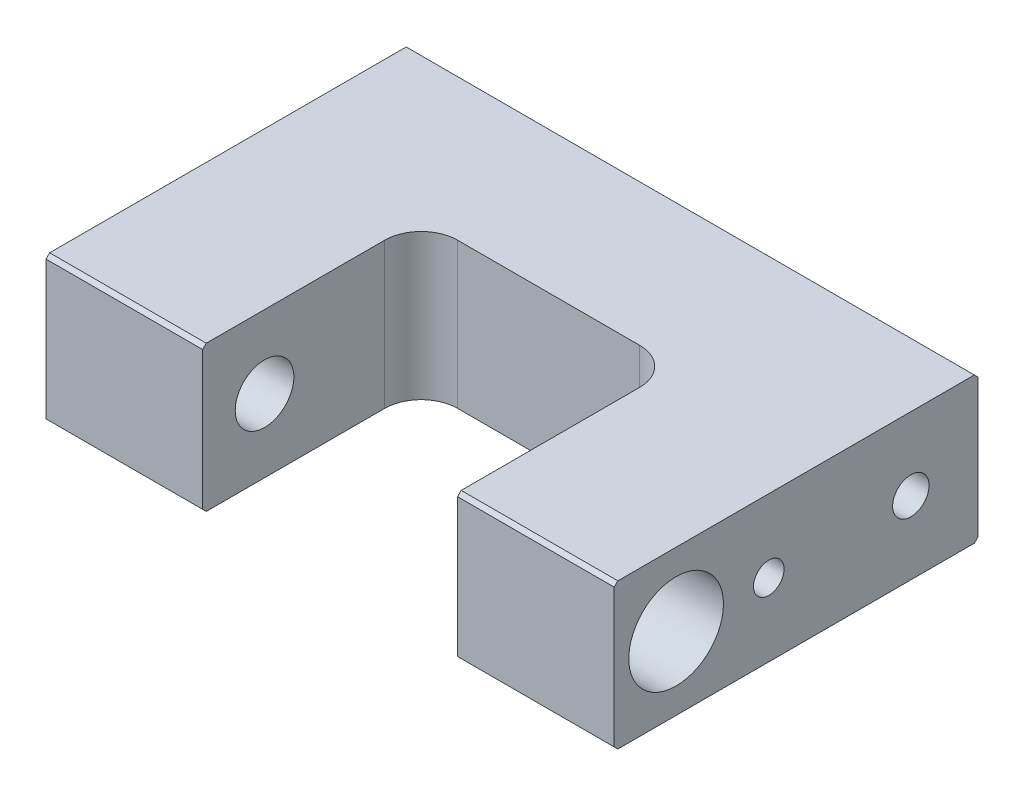
ISO-10303-21;
HEADER;
FILE_DESCRIPTION(('STEP AP214'),'2;1');
FILE_NAME('part.step','',(''),(''),'','','');
FILE_SCHEMA(('AUTOMOTIVE_DESIGN { 1 0 10303 214 1 1 1 1 }'));
ENDSEC;
DATA;
#1=APPLICATION_CONTEXT('core data for automotive mechanical design processes');
#2=APPLICATION_PROTOCOL_DEFINITION('international standard','automotive_design',2000,#1);
#3=PRODUCT_CONTEXT('',#1,'mechanical');
#4=PRODUCT('Part','Part','',(#3));
#5=PRODUCT_RELATED_PRODUCT_CATEGORY('part','',(#4));
#6=PRODUCT_DEFINITION_FORMATION('','',#4);
#7=PRODUCT_DEFINITION_CONTEXT('part definition',#1,'design');
#8=PRODUCT_DEFINITION('design','',#6,#7);
#9=PRODUCT_DEFINITION_SHAPE('','',#8);
#10=(LENGTH_UNIT() NAMED_UNIT(*) SI_UNIT(.MILLI.,.METRE.));
#11=(NAMED_UNIT(*) PLANE_ANGLE_UNIT() SI_UNIT($,.RADIAN.));
#12=(NAMED_UNIT(*) SI_UNIT($,.STERADIAN.) SOLID_ANGLE_UNIT());
#13=UNCERTAINTY_MEASURE_WITH_UNIT(LENGTH_MEASURE(1.E-05),#10,'distance_accuracy_value','');
#14=(GEOMETRIC_REPRESENTATION_CONTEXT(3) GLOBAL_UNCERTAINTY_ASSIGNED_CONTEXT((#13)) GLOBAL_UNIT_ASSIGNED_CONTEXT((#10,
#11,#12)) REPRESENTATION_CONTEXT('',''));
#15=CARTESIAN_POINT('',(0.,0.,0.));
#16=DIRECTION('',(0.,0.,1.));
#17=DIRECTION('',(1.,0.,0.));
#18=AXIS2_PLACEMENT_3D('',#15,#16,#17);
#19=CARTESIAN_POINT('',(39.,10.,18.7208121827411));
#20=DIRECTION('',(-1.,0.,0.));
#21=DIRECTION('',(0.,0.,1.));
#22=AXIS2_PLACEMENT_3D('',#19,#20,#21);
#23=CYLINDRICAL_SURFACE('',#22,4.025);
#24=CARTESIAN_POINT('',(17.5,10.,18.7208121827411));
#25=DIRECTION('',(1.,0.,0.));
#26=DIRECTION('',(0.,0.,-1.));
#27=AXIS2_PLACEMENT_3D('',#24,#25,#26);
#28=CIRCLE('',#27,4.025);
#29=CARTESIAN_POINT('',(17.5,10.,14.6958121827411));
#30=VERTEX_POINT('',#29);
#31=EDGE_CURVE('E237',#30,#30,#28,.T.);
#32=ORIENTED_EDGE('',*,*,#31,.F.);
#33=EDGE_LOOP('',(#32));
#34=FACE_BOUND('',#33,.T.);
#35=CARTESIAN_POINT('',(26.5,10.,18.7208121827411));
#36=DIRECTION('',(1.,0.,0.));
#37=DIRECTION('',(0.,0.,-1.));
#38=AXIS2_PLACEMENT_3D('',#35,#36,#37);
#39=CIRCLE('',#38,4.025);
#40=CARTESIAN_POINT('',(26.5,10.,14.6958121827411));
#41=VERTEX_POINT('',#40);
#42=EDGE_CURVE('E239',#41,#41,#39,.F.);
#43=ORIENTED_EDGE('',*,*,#42,.F.);
#44=EDGE_LOOP('',(#43));
#45=FACE_BOUND('',#44,.T.);
#46=ADVANCED_FACE('F41',(#34,#45),#23,.F.);
#47=CARTESIAN_POINT('',(-39.,20.,27.2208121827411));
#48=DIRECTION('',(0.,0.,-1.));
#49=DIRECTION('',(-1.,0.,0.));
#50=AXIS2_PLACEMENT_3D('',#47,#48,#49);
#51=PLANE('',#50);
#52=DIRECTION('',(0.,1.,0.));
#53=VECTOR('',#52,1.);
#54=CARTESIAN_POINT('',(17.5,0.,27.2208121827411));
#55=LINE('',#54,#53);
#56=CARTESIAN_POINT('',(17.5,0.5,27.2208121827411));
#57=VERTEX_POINT('',#56);
#58=CARTESIAN_POINT('',(17.5,19.5,27.2208121827411));
#59=VERTEX_POINT('',#58);
#60=EDGE_CURVE('E204',#57,#59,#55,.T.);
#61=ORIENTED_EDGE('',*,*,#60,.F.);
#62=DIRECTION('',(1.,0.,0.));
#63=VECTOR('',#62,1.);
#64=CARTESIAN_POINT('',(-39.,0.5,27.2208121827411));
#65=LINE('',#64,#63);
#66=CARTESIAN_POINT('',(39.,0.5,27.2208121827411));
#67=VERTEX_POINT('',#66);
#68=EDGE_CURVE('E244',#57,#67,#65,.T.);
#69=ORIENTED_EDGE('',*,*,#68,.T.);
#70=DIRECTION('',(0.,-1.,0.));
#71=VECTOR('',#70,1.);
#72=CARTESIAN_POINT('',(39.,20.,27.2208121827411));
#73=LINE('',#72,#71);
#74=CARTESIAN_POINT('',(39.,19.5,27.2208121827411));
#75=VERTEX_POINT('',#74);
#76=EDGE_CURVE('E223',#75,#67,#73,.T.);
#77=ORIENTED_EDGE('',*,*,#76,.F.);
#78=DIRECTION('',(-1.,0.,0.));
#79=VECTOR('',#78,1.);
#80=CARTESIAN_POINT('',(17.5,19.5,27.2208121827411));
#81=LINE('',#80,#79);
#82=EDGE_CURVE('E233',#75,#59,#81,.T.);
#83=ORIENTED_EDGE('',*,*,#82,.T.);
#84=EDGE_LOOP('',(#61,#69,#77,#83));
#85=FACE_BOUND('',#84,.T.);
#86=ADVANCED_FACE('F334',(#85),#51,.F.);
#87=CARTESIAN_POINT('',(39.,20.,-27.2208121827411));
#88=DIRECTION('',(-1.,0.,0.));
#89=DIRECTION('',(0.,0.,1.));
#90=AXIS2_PLACEMENT_3D('',#87,#88,#89);
#91=PLANE('',#90);
#92=CARTESIAN_POINT('',(39.,10.,6.));
#93=DIRECTION('',(1.,0.,0.));
#94=DIRECTION('',(0.,0.,-1.));
#95=AXIS2_PLACEMENT_3D('',#92,#93,#94);
#96=CIRCLE('',#95,2.1);
#97=CARTESIAN_POINT('',(39.,10.,3.9));
#98=VERTEX_POINT('',#97);
#99=EDGE_CURVE('E300',#98,#98,#96,.T.);
#100=ORIENTED_EDGE('',*,*,#99,.F.);
#101=EDGE_LOOP('',(#100));
#102=FACE_BOUND('',#101,.T.);
#103=CARTESIAN_POINT('',(39.,10.,-13.5));
#104=DIRECTION('',(1.,0.,0.));
#105=DIRECTION('',(0.,0.,-1.));
#106=AXIS2_PLACEMENT_3D('',#103,#104,#105);
#107=CIRCLE('',#106,2.5);
#108=CARTESIAN_POINT('',(39.,10.,-16.));
#109=VERTEX_POINT('',#108);
#110=EDGE_CURVE('E628',#109,#109,#107,.T.);
#111=ORIENTED_EDGE('',*,*,#110,.F.);
#112=EDGE_LOOP('',(#111));
#113=FACE_BOUND('',#112,.T.);
#114=CARTESIAN_POINT('',(39.,10.,18.7208121827411));
#115=DIRECTION('',(1.,0.,0.));
#116=DIRECTION('',(0.,0.,-1.));
#117=AXIS2_PLACEMENT_3D('',#114,#115,#116);
#118=CIRCLE('',#117,6.5);
#119=CARTESIAN_POINT('',(39.,10.,12.2208121827411));
#120=VERTEX_POINT('',#119);
#121=EDGE_CURVE('E631',#120,#120,#118,.T.);
#122=ORIENTED_EDGE('',*,*,#121,.F.);
#123=EDGE_LOOP('',(#122));
#124=FACE_BOUND('',#123,.T.);
#125=ORIENTED_EDGE('',*,*,#76,.T.);
#126=DIRECTION('',(0.,0.707106781186548,0.707106781186548));
#127=VECTOR('',#126,1.);
#128=CARTESIAN_POINT('',(39.,0.500000000000005,27.2208121827411));
#129=LINE('',#128,#127);
#130=CARTESIAN_POINT('',(39.,0.,26.7208121827411));
#131=VERTEX_POINT('',#130);
#132=EDGE_CURVE('E253',#67,#131,#129,.F.);
#133=ORIENTED_EDGE('',*,*,#132,.T.);
#134=DIRECTION('',(0.,0.,-1.));
#135=VECTOR('',#134,1.);
#136=CARTESIAN_POINT('',(39.,0.,-27.2208121827411));
#137=LINE('',#136,#135);
#138=CARTESIAN_POINT('',(39.,0.,-22.2208121827411));
#139=VERTEX_POINT('',#138);
#140=EDGE_CURVE('E207',#131,#139,#137,.T.);
#141=ORIENTED_EDGE('',*,*,#140,.T.);
#142=DIRECTION('',(0.,-0.707106781186549,0.707106781186547));
#143=VECTOR('',#142,1.);
#144=CARTESIAN_POINT('',(39.,0.500000000000014,-22.7208121827411));
#145=LINE('',#144,#143);
#146=CARTESIAN_POINT('',(39.,0.500000000000014,-22.7208121827411));
#147=VERTEX_POINT('',#146);
#148=EDGE_CURVE('E249',#139,#147,#145,.F.);
#149=ORIENTED_EDGE('',*,*,#148,.T.);
#150=DIRECTION('',(0.,1.,0.));
#151=VECTOR('',#150,1.);
#152=CARTESIAN_POINT('',(39.,20.,-22.7208121827411));
#153=LINE('',#152,#151);
#154=CARTESIAN_POINT('',(39.,19.5,-22.7208121827411));
#155=VERTEX_POINT('',#154);
#156=EDGE_CURVE('E292',#147,#155,#153,.T.);
#157=ORIENTED_EDGE('',*,*,#156,.T.);
#158=DIRECTION('',(0.,0.707106781186549,0.707106781186547));
#159=VECTOR('',#158,1.);
#160=CARTESIAN_POINT('',(39.,20.,-22.2208121827411));
#161=LINE('',#160,#159);
#162=CARTESIAN_POINT('',(39.,20.,-22.2208121827411));
#163=VERTEX_POINT('',#162);
#164=EDGE_CURVE('E247',#155,#163,#161,.T.);
#165=ORIENTED_EDGE('',*,*,#164,.T.);
#166=DIRECTION('',(0.,0.,-1.));
#167=VECTOR('',#166,1.);
#168=CARTESIAN_POINT('',(39.,20.,-27.2208121827411));
#169=LINE('',#168,#167);
#170=CARTESIAN_POINT('',(39.,20.,26.7208121827411));
#171=VERTEX_POINT('',#170);
#172=EDGE_CURVE('E216',#171,#163,#169,.T.);
#173=ORIENTED_EDGE('',*,*,#172,.F.);
#174=DIRECTION('',(0.,-0.707106781186548,0.707106781186548));
#175=VECTOR('',#174,1.);
#176=CARTESIAN_POINT('',(39.,20.,26.7208121827411));
#177=LINE('',#176,#175);
#178=EDGE_CURVE('E251',#171,#75,#177,.T.);
#179=ORIENTED_EDGE('',*,*,#178,.T.);
#180=EDGE_LOOP('',(#125,#133,#141,#149,#157,#165,#173,#179));
#181=FACE_BOUND('',#180,.T.);
#182=ADVANCED_FACE('F297',(#102,#113,#124,#181),#91,.F.);
#183=CARTESIAN_POINT('',(-39.,20.,-27.2208121827411));
#184=DIRECTION('',(1.,0.,0.));
#185=DIRECTION('',(0.,0.,-1.));
#186=AXIS2_PLACEMENT_3D('',#183,#184,#185);
#187=PLANE('',#186);
#188=CARTESIAN_POINT('',(-39.,10.,18.7208121827411));
#189=DIRECTION('',(-1.,0.,0.));
#190=DIRECTION('',(0.,0.,1.));
#191=AXIS2_PLACEMENT_3D('',#188,#189,#190);
#192=CIRCLE('',#191,6.5);
#193=CARTESIAN_POINT('',(-39.,10.,25.2208121827411));
#194=VERTEX_POINT('',#193);
#195=EDGE_CURVE('E644',#194,#194,#192,.T.);
#196=ORIENTED_EDGE('',*,*,#195,.F.);
#197=EDGE_LOOP('',(#196));
#198=FACE_BOUND('',#197,.T.);
#199=CARTESIAN_POINT('',(-39.,10.,6.));
#200=DIRECTION('',(-1.,0.,0.));
#201=DIRECTION('',(0.,0.,1.));
#202=AXIS2_PLACEMENT_3D('',#199,#200,#201);
#203=CIRCLE('',#202,2.1);
#204=CARTESIAN_POINT('',(-39.,10.,8.1));
#205=VERTEX_POINT('',#204);
#206=EDGE_CURVE('E648',#205,#205,#203,.T.);
#207=ORIENTED_EDGE('',*,*,#206,.F.);
#208=EDGE_LOOP('',(#207));
#209=FACE_BOUND('',#208,.T.);
#210=CARTESIAN_POINT('',(-39.,10.,-13.5));
#211=DIRECTION('',(-1.,0.,0.));
#212=DIRECTION('',(0.,0.,1.));
#213=AXIS2_PLACEMENT_3D('',#210,#211,#212);
#214=CIRCLE('',#213,2.5);
#215=CARTESIAN_POINT('',(-39.,10.,-11.));
#216=VERTEX_POINT('',#215);
#217=EDGE_CURVE('E654',#216,#216,#214,.T.);
#218=ORIENTED_EDGE('',*,*,#217,.F.);
#219=EDGE_LOOP('',(#218));
#220=FACE_BOUND('',#219,.T.);
#221=DIRECTION('',(0.,0.,1.));
#222=VECTOR('',#221,1.);
#223=CARTESIAN_POINT('',(-39.,0.,-27.2208121827411));
#224=LINE('',#223,#222);
#225=CARTESIAN_POINT('',(-39.,0.,-22.2208121827411));
#226=VERTEX_POINT('',#225);
#227=CARTESIAN_POINT('',(-39.,0.,26.7208121827411));
#228=VERTEX_POINT('',#227);
#229=EDGE_CURVE('E220',#226,#228,#224,.T.);
#230=ORIENTED_EDGE('',*,*,#229,.T.);
#231=DIRECTION('',(0.,-0.707106781186548,-0.707106781186548));
#232=VECTOR('',#231,1.);
#233=CARTESIAN_POINT('',(-39.,0.5,27.2208121827411));
#234=LINE('',#233,#232);
#235=CARTESIAN_POINT('',(-39.,0.5,27.2208121827411));
#236=VERTEX_POINT('',#235);
#237=EDGE_CURVE('E286',#228,#236,#234,.F.);
#238=ORIENTED_EDGE('',*,*,#237,.T.);
#239=DIRECTION('',(0.,-1.,0.));
#240=VECTOR('',#239,1.);
#241=CARTESIAN_POINT('',(-39.,20.,27.2208121827411));
#242=LINE('',#241,#240);
#243=CARTESIAN_POINT('',(-39.,19.5,27.2208121827411));
#244=VERTEX_POINT('',#243);
#245=EDGE_CURVE('E230',#244,#236,#242,.T.);
#246=ORIENTED_EDGE('',*,*,#245,.F.);
#247=DIRECTION('',(0.,0.707106781186548,-0.707106781186548));
#248=VECTOR('',#247,1.);
#249=CARTESIAN_POINT('',(-39.,20.,26.7208121827411));
#250=LINE('',#249,#248);
#251=CARTESIAN_POINT('',(-39.,20.,26.7208121827411));
#252=VERTEX_POINT('',#251);
#253=EDGE_CURVE('E284',#244,#252,#250,.T.);
#254=ORIENTED_EDGE('',*,*,#253,.T.);
#255=DIRECTION('',(0.,0.,1.));
#256=VECTOR('',#255,1.);
#257=CARTESIAN_POINT('',(-39.,20.,-27.2208121827411));
#258=LINE('',#257,#256);
#259=CARTESIAN_POINT('',(-39.,20.,-22.2208121827411));
#260=VERTEX_POINT('',#259);
#261=EDGE_CURVE('E219',#260,#252,#258,.T.);
#262=ORIENTED_EDGE('',*,*,#261,.F.);
#263=DIRECTION('',(0.,-0.707106781186549,-0.707106781186547));
#264=VECTOR('',#263,1.);
#265=CARTESIAN_POINT('',(-39.,20.,-22.2208121827411));
#266=LINE('',#265,#264);
#267=CARTESIAN_POINT('',(-39.,19.5,-22.7208121827411));
#268=VERTEX_POINT('',#267);
#269=EDGE_CURVE('E57',#260,#268,#266,.T.);
#270=ORIENTED_EDGE('',*,*,#269,.T.);
#271=DIRECTION('',(0.,1.,0.));
#272=VECTOR('',#271,1.);
#273=CARTESIAN_POINT('',(-39.,20.,-22.7208121827411));
#274=LINE('',#273,#272);
#275=CARTESIAN_POINT('',(-39.,0.500000000000014,-22.7208121827411));
#276=VERTEX_POINT('',#275);
#277=EDGE_CURVE('E293',#276,#268,#274,.T.);
#278=ORIENTED_EDGE('',*,*,#277,.F.);
#279=DIRECTION('',(0.,0.707106781186549,-0.707106781186547));
#280=VECTOR('',#279,1.);
#281=CARTESIAN_POINT('',(-39.,0.500000000000014,-22.7208121827411));
#282=LINE('',#281,#280);
#283=EDGE_CURVE('E65',#276,#226,#282,.F.);
#284=ORIENTED_EDGE('',*,*,#283,.T.);
#285=EDGE_LOOP('',(#230,#238,#246,#254,#262,#270,#278,#284));
#286=FACE_BOUND('',#285,.T.);
#287=ADVANCED_FACE('F306',(#198,#209,#220,#286),#187,.F.);
#288=ORIENTED_EDGE('',*,*,#245,.T.);
#289=DIRECTION('',(1.,0.,0.));
#290=VECTOR('',#289,1.);
#291=CARTESIAN_POINT('',(-39.,0.5,27.2208121827411));
#292=LINE('',#291,#290);
#293=CARTESIAN_POINT('',(-17.5,0.5,27.2208121827411));
#294=VERTEX_POINT('',#293);
#295=EDGE_CURVE('E275',#236,#294,#292,.T.);
#296=ORIENTED_EDGE('',*,*,#295,.T.);
#297=DIRECTION('',(0.,1.,0.));
#298=VECTOR('',#297,1.);
#299=CARTESIAN_POINT('',(-17.5,0.,27.2208121827411));
#300=LINE('',#299,#298);
#301=CARTESIAN_POINT('',(-17.5,19.5,27.2208121827411));
#302=VERTEX_POINT('',#301);
#303=EDGE_CURVE('E208',#294,#302,#300,.T.);
#304=ORIENTED_EDGE('',*,*,#303,.T.);
#305=DIRECTION('',(-1.,0.,0.));
#306=VECTOR('',#305,1.);
#307=CARTESIAN_POINT('',(-39.,19.5,27.2208121827411));
#308=LINE('',#307,#306);
#309=EDGE_CURVE('E273',#302,#244,#308,.T.);
#310=ORIENTED_EDGE('',*,*,#309,.T.);
#311=EDGE_LOOP('',(#288,#296,#304,#310));
#312=FACE_BOUND('',#311,.T.);
#313=ADVANCED_FACE('F331',(#312),#51,.F.);
#314=CARTESIAN_POINT('',(0.,20.,0.));
#315=DIRECTION('',(0.,1.,0.));
#316=DIRECTION('',(0.,0.,1.));
#317=AXIS2_PLACEMENT_3D('',#314,#315,#316);
#318=PLANE('',#317);
#319=DIRECTION('',(0.,0.,-1.));
#320=VECTOR('',#319,1.);
#321=CARTESIAN_POINT('',(17.5,20.,2.22081218274111));
#322=LINE('',#321,#320);
#323=CARTESIAN_POINT('',(17.5,20.,26.7208121827411));
#324=VERTEX_POINT('',#323);
#325=CARTESIAN_POINT('',(17.5,20.,2.22081218274111));
#326=VERTEX_POINT('',#325);
#327=EDGE_CURVE('E173',#324,#326,#322,.T.);
#328=ORIENTED_EDGE('',*,*,#327,.F.);
#329=DIRECTION('',(1.,0.,0.));
#330=VECTOR('',#329,1.);
#331=CARTESIAN_POINT('',(39.,20.,26.7208121827411));
#332=LINE('',#331,#330);
#333=EDGE_CURVE('E270',#324,#171,#332,.T.);
#334=ORIENTED_EDGE('',*,*,#333,.T.);
#335=ORIENTED_EDGE('',*,*,#172,.T.);
#336=DIRECTION('',(-1.,0.,0.));
#337=VECTOR('',#336,1.);
#338=CARTESIAN_POINT('',(-39.,20.,-22.2208121827411));
#339=LINE('',#338,#337);
#340=EDGE_CURVE('E264',#163,#260,#339,.T.);
#341=ORIENTED_EDGE('',*,*,#340,.T.);
#342=ORIENTED_EDGE('',*,*,#261,.T.);
#343=DIRECTION('',(1.,0.,0.));
#344=VECTOR('',#343,1.);
#345=CARTESIAN_POINT('',(-17.5,20.,26.7208121827411));
#346=LINE('',#345,#344);
#347=CARTESIAN_POINT('',(-17.5,20.,26.7208121827411));
#348=VERTEX_POINT('',#347);
#349=EDGE_CURVE('E267',#252,#348,#346,.T.);
#350=ORIENTED_EDGE('',*,*,#349,.T.);
#351=DIRECTION('',(0.,0.,1.));
#352=VECTOR('',#351,1.);
#353=CARTESIAN_POINT('',(-17.5,20.,27.2208121827411));
#354=LINE('',#353,#352);
#355=CARTESIAN_POINT('',(-17.5,20.,2.22081218274111));
#356=VERTEX_POINT('',#355);
#357=EDGE_CURVE('E167',#356,#348,#354,.T.);
#358=ORIENTED_EDGE('',*,*,#357,.F.);
#359=CARTESIAN_POINT('',(-12.5,20.,2.22081218274111));
#360=DIRECTION('',(0.,1.,0.));
#361=DIRECTION('',(0.,0.,-1.));
#362=AXIS2_PLACEMENT_3D('',#359,#360,#361);
#363=CIRCLE('',#362,5.00000000000001);
#364=CARTESIAN_POINT('',(-12.5,20.,-2.7791878172589));
#365=VERTEX_POINT('',#364);
#366=EDGE_CURVE('E199',#365,#356,#363,.T.);
#367=ORIENTED_EDGE('',*,*,#366,.F.);
#368=DIRECTION('',(-1.,0.,0.));
#369=VECTOR('',#368,1.);
#370=CARTESIAN_POINT('',(-12.5,20.,-2.7791878172589));
#371=LINE('',#370,#369);
#372=CARTESIAN_POINT('',(12.5,20.,-2.7791878172589));
#373=VERTEX_POINT('',#372);
#374=EDGE_CURVE('E196',#373,#365,#371,.T.);
#375=ORIENTED_EDGE('',*,*,#374,.F.);
#376=CARTESIAN_POINT('',(12.5,20.,2.22081218274111));
#377=DIRECTION('',(0.,1.,0.));
#378=DIRECTION('',(0.,0.,1.));
#379=AXIS2_PLACEMENT_3D('',#376,#377,#378);
#380=CIRCLE('',#379,5.00000000000001);
#381=EDGE_CURVE('E193',#326,#373,#380,.T.);
#382=ORIENTED_EDGE('',*,*,#381,.F.);
#383=EDGE_LOOP('',(#328,#334,#335,#341,#342,#350,#358,#367,#375,#382));
#384=FACE_BOUND('',#383,.T.);
#385=ADVANCED_FACE('F304',(#384),#318,.T.);
#386=CARTESIAN_POINT('',(0.,0.,0.));
#387=DIRECTION('',(0.,1.,0.));
#388=DIRECTION('',(0.,0.,1.));
#389=AXIS2_PLACEMENT_3D('',#386,#387,#388);
#390=PLANE('',#389);
#391=ORIENTED_EDGE('',*,*,#140,.F.);
#392=DIRECTION('',(-1.,0.,0.));
#393=VECTOR('',#392,1.);
#394=CARTESIAN_POINT('',(0.,0.,26.7208121827411));
#395=LINE('',#394,#393);
#396=CARTESIAN_POINT('',(17.5,0.,26.7208121827411));
#397=VERTEX_POINT('',#396);
#398=EDGE_CURVE('E164',#131,#397,#395,.T.);
#399=ORIENTED_EDGE('',*,*,#398,.T.);
#400=DIRECTION('',(0.,0.,-1.));
#401=VECTOR('',#400,1.);
#402=CARTESIAN_POINT('',(17.5,0.,2.22081218274111));
#403=LINE('',#402,#401);
#404=CARTESIAN_POINT('',(17.5,0.,2.22081218274111));
#405=VERTEX_POINT('',#404);
#406=EDGE_CURVE('E156',#397,#405,#403,.T.);
#407=ORIENTED_EDGE('',*,*,#406,.T.);
#408=CARTESIAN_POINT('',(12.5,0.,2.22081218274111));
#409=DIRECTION('',(0.,1.,0.));
#410=DIRECTION('',(0.,0.,1.));
#411=AXIS2_PLACEMENT_3D('',#408,#409,#410);
#412=CIRCLE('',#411,5.00000000000001);
#413=CARTESIAN_POINT('',(12.5,0.,-2.7791878172589));
#414=VERTEX_POINT('',#413);
#415=EDGE_CURVE('E162',#405,#414,#412,.T.);
#416=ORIENTED_EDGE('',*,*,#415,.T.);
#417=DIRECTION('',(-1.,0.,0.));
#418=VECTOR('',#417,1.);
#419=CARTESIAN_POINT('',(-12.5,0.,-2.7791878172589));
#420=LINE('',#419,#418);
#421=CARTESIAN_POINT('',(-12.5,0.,-2.7791878172589));
#422=VERTEX_POINT('',#421);
#423=EDGE_CURVE('E182',#414,#422,#420,.T.);
#424=ORIENTED_EDGE('',*,*,#423,.T.);
#425=CARTESIAN_POINT('',(-12.5,0.,2.22081218274111));
#426=DIRECTION('',(0.,1.,0.));
#427=DIRECTION('',(0.,0.,-1.));
#428=AXIS2_PLACEMENT_3D('',#425,#426,#427);
#429=CIRCLE('',#428,5.00000000000001);
#430=CARTESIAN_POINT('',(-17.5,0.,2.22081218274111));
#431=VERTEX_POINT('',#430);
#432=EDGE_CURVE('E184',#422,#431,#429,.T.);
#433=ORIENTED_EDGE('',*,*,#432,.T.);
#434=DIRECTION('',(0.,0.,1.));
#435=VECTOR('',#434,1.);
#436=CARTESIAN_POINT('',(-17.5,0.,27.2208121827411));
#437=LINE('',#436,#435);
#438=CARTESIAN_POINT('',(-17.5,0.,26.7208121827411));
#439=VERTEX_POINT('',#438);
#440=EDGE_CURVE('E178',#431,#439,#437,.T.);
#441=ORIENTED_EDGE('',*,*,#440,.T.);
#442=DIRECTION('',(-1.,0.,0.));
#443=VECTOR('',#442,1.);
#444=CARTESIAN_POINT('',(0.,0.,26.7208121827411));
#445=LINE('',#444,#443);
#446=EDGE_CURVE('E257',#439,#228,#445,.T.);
#447=ORIENTED_EDGE('',*,*,#446,.T.);
#448=ORIENTED_EDGE('',*,*,#229,.F.);
#449=DIRECTION('',(1.,0.,0.));
#450=VECTOR('',#449,1.);
#451=CARTESIAN_POINT('',(0.,0.,-22.2208121827411));
#452=LINE('',#451,#450);
#453=EDGE_CURVE('E255',#226,#139,#452,.T.);
#454=ORIENTED_EDGE('',*,*,#453,.T.);
#455=EDGE_LOOP('',(#391,#399,#407,#416,#424,#433,#441,#447,#448,#454));
#456=FACE_BOUND('',#455,.T.);
#457=ADVANCED_FACE('F159',(#456),#390,.F.);
#458=CARTESIAN_POINT('',(17.5,0.,2.22081218274111));
#459=DIRECTION('',(1.,0.,0.));
#460=DIRECTION('',(0.,0.,-1.));
#461=AXIS2_PLACEMENT_3D('',#458,#459,#460);
#462=PLANE('',#461);
#463=ORIENTED_EDGE('',*,*,#31,.T.);
#464=EDGE_LOOP('',(#463));
#465=FACE_BOUND('',#464,.T.);
#466=ORIENTED_EDGE('',*,*,#406,.F.);
#467=DIRECTION('',(0.,-0.707106781186548,-0.707106781186548));
#468=VECTOR('',#467,1.);
#469=CARTESIAN_POINT('',(17.5,0.500000000000008,27.2208121827411));
#470=LINE('',#469,#468);
#471=EDGE_CURVE('E262',#397,#57,#470,.F.);
#472=ORIENTED_EDGE('',*,*,#471,.T.);
#473=ORIENTED_EDGE('',*,*,#60,.T.);
#474=DIRECTION('',(0.,0.707106781186548,-0.707106781186548));
#475=VECTOR('',#474,1.);
#476=CARTESIAN_POINT('',(17.5,20.,26.7208121827411));
#477=LINE('',#476,#475);
#478=EDGE_CURVE('E260',#59,#324,#477,.T.);
#479=ORIENTED_EDGE('',*,*,#478,.T.);
#480=ORIENTED_EDGE('',*,*,#327,.T.);
#481=DIRECTION('',(0.,1.,0.));
#482=VECTOR('',#481,1.);
#483=CARTESIAN_POINT('',(17.5,0.,2.22081218274111));
#484=LINE('',#483,#482);
#485=EDGE_CURVE('E170',#405,#326,#484,.T.);
#486=ORIENTED_EDGE('',*,*,#485,.F.);
#487=EDGE_LOOP('',(#466,#472,#473,#479,#480,#486));
#488=FACE_BOUND('',#487,.T.);
#489=ADVANCED_FACE('F171',(#465,#488),#462,.F.);
#490=CARTESIAN_POINT('',(-17.5,0.,27.2208121827411));
#491=DIRECTION('',(-1.,0.,0.));
#492=DIRECTION('',(0.,0.,1.));
#493=AXIS2_PLACEMENT_3D('',#490,#491,#492);
#494=PLANE('',#493);
#495=CARTESIAN_POINT('',(-17.5,10.,18.7208121827411));
#496=DIRECTION('',(-1.,0.,0.));
#497=DIRECTION('',(0.,0.,1.));
#498=AXIS2_PLACEMENT_3D('',#495,#496,#497);
#499=CIRCLE('',#498,4.025);
#500=CARTESIAN_POINT('',(-17.5,10.,22.7458121827411));
#501=VERTEX_POINT('',#500);
#502=EDGE_CURVE('E234',#501,#501,#499,.T.);
#503=ORIENTED_EDGE('',*,*,#502,.T.);
#504=EDGE_LOOP('',(#503));
#505=FACE_BOUND('',#504,.T.);
#506=ORIENTED_EDGE('',*,*,#303,.F.);
#507=DIRECTION('',(0.,0.707106781186548,0.707106781186548));
#508=VECTOR('',#507,1.);
#509=CARTESIAN_POINT('',(-17.5,0.499999999999997,27.2208121827411));
#510=LINE('',#509,#508);
#511=EDGE_CURVE('E280',#294,#439,#510,.F.);
#512=ORIENTED_EDGE('',*,*,#511,.T.);
#513=ORIENTED_EDGE('',*,*,#440,.F.);
#514=DIRECTION('',(0.,1.,0.));
#515=VECTOR('',#514,1.);
#516=CARTESIAN_POINT('',(-17.5,0.,2.22081218274111));
#517=LINE('',#516,#515);
#518=EDGE_CURVE('E211',#431,#356,#517,.T.);
#519=ORIENTED_EDGE('',*,*,#518,.T.);
#520=ORIENTED_EDGE('',*,*,#357,.T.);
#521=DIRECTION('',(0.,-0.707106781186548,0.707106781186548));
#522=VECTOR('',#521,1.);
#523=CARTESIAN_POINT('',(-17.5,20.,26.7208121827411));
#524=LINE('',#523,#522);
#525=EDGE_CURVE('E278',#348,#302,#524,.T.);
#526=ORIENTED_EDGE('',*,*,#525,.T.);
#527=EDGE_LOOP('',(#506,#512,#513,#519,#520,#526));
#528=FACE_BOUND('',#527,.T.);
#529=ADVANCED_FACE('F316',(#505,#528),#494,.F.);
#530=CARTESIAN_POINT('',(-12.5,0.,2.22081218274111));
#531=DIRECTION('',(0.,1.,0.));
#532=DIRECTION('',(0.,0.,1.));
#533=AXIS2_PLACEMENT_3D('',#530,#531,#532);
#534=CYLINDRICAL_SURFACE('',#533,5.00000000000001);
#535=ORIENTED_EDGE('',*,*,#366,.T.);
#536=ORIENTED_EDGE('',*,*,#518,.F.);
#537=ORIENTED_EDGE('',*,*,#432,.F.);
#538=DIRECTION('',(0.,1.,0.));
#539=VECTOR('',#538,1.);
#540=CARTESIAN_POINT('',(-12.5,0.,-2.7791878172589));
#541=LINE('',#540,#539);
#542=EDGE_CURVE('E213',#422,#365,#541,.T.);
#543=ORIENTED_EDGE('',*,*,#542,.T.);
#544=EDGE_LOOP('',(#535,#536,#537,#543));
#545=FACE_BOUND('',#544,.T.);
#546=ADVANCED_FACE('F320',(#545),#534,.F.);
#547=CARTESIAN_POINT('',(-12.5,0.,-2.7791878172589));
#548=DIRECTION('',(0.,0.,-1.));
#549=DIRECTION('',(-1.,0.,0.));
#550=AXIS2_PLACEMENT_3D('',#547,#548,#549);
#551=PLANE('',#550);
#552=ORIENTED_EDGE('',*,*,#374,.T.);
#553=ORIENTED_EDGE('',*,*,#542,.F.);
#554=ORIENTED_EDGE('',*,*,#423,.F.);
#555=DIRECTION('',(0.,1.,0.));
#556=VECTOR('',#555,1.);
#557=CARTESIAN_POINT('',(12.5,0.,-2.7791878172589));
#558=LINE('',#557,#556);
#559=EDGE_CURVE('E177',#414,#373,#558,.T.);
#560=ORIENTED_EDGE('',*,*,#559,.T.);
#561=EDGE_LOOP('',(#552,#553,#554,#560));
#562=FACE_BOUND('',#561,.T.);
#563=ADVANCED_FACE('F323',(#562),#551,.F.);
#564=CARTESIAN_POINT('',(12.5,0.,2.22081218274111));
#565=DIRECTION('',(0.,1.,0.));
#566=DIRECTION('',(0.,0.,1.));
#567=AXIS2_PLACEMENT_3D('',#564,#565,#566);
#568=CYLINDRICAL_SURFACE('',#567,5.00000000000001);
#569=ORIENTED_EDGE('',*,*,#381,.T.);
#570=ORIENTED_EDGE('',*,*,#559,.F.);
#571=ORIENTED_EDGE('',*,*,#415,.F.);
#572=ORIENTED_EDGE('',*,*,#485,.T.);
#573=EDGE_LOOP('',(#569,#570,#571,#572));
#574=FACE_BOUND('',#573,.T.);
#575=ADVANCED_FACE('F181',(#574),#568,.F.);
#576=CARTESIAN_POINT('',(-24.,10.,-13.5));
#577=DIRECTION('',(-1.,0.,0.));
#578=DIRECTION('',(0.,0.,1.));
#579=AXIS2_PLACEMENT_3D('',#576,#577,#578);
#580=CYLINDRICAL_SURFACE('',#579,2.5);
#581=CARTESIAN_POINT('',(-24.,10.,-13.5));
#582=DIRECTION('',(-1.,0.,0.));
#583=DIRECTION('',(0.,0.,1.));
#584=AXIS2_PLACEMENT_3D('',#581,#582,#583);
#585=CIRCLE('',#584,2.5);
#586=CARTESIAN_POINT('',(-24.,10.,-11.));
#587=VERTEX_POINT('',#586);
#588=EDGE_CURVE('E194',#587,#587,#585,.T.);
#589=ORIENTED_EDGE('',*,*,#588,.F.);
#590=EDGE_LOOP('',(#589));
#591=FACE_BOUND('',#590,.T.);
#592=ORIENTED_EDGE('',*,*,#217,.T.);
#593=EDGE_LOOP('',(#592));
#594=FACE_BOUND('',#593,.T.);
#595=ADVANCED_FACE('F384',(#591,#594),#580,.F.);
#596=CARTESIAN_POINT('',(-24.,10.,-13.5));
#597=DIRECTION('',(-1.,0.,0.));
#598=DIRECTION('',(0.,0.,1.));
#599=AXIS2_PLACEMENT_3D('',#596,#597,#598);
#600=PLANE('',#599);
#601=ORIENTED_EDGE('',*,*,#588,.T.);
#602=EDGE_LOOP('',(#601));
#603=FACE_BOUND('',#602,.T.);
#604=ADVANCED_FACE('F436',(#603),#600,.T.);
#605=CARTESIAN_POINT('',(-29.,10.,6.));
#606=DIRECTION('',(-1.,0.,0.));
#607=DIRECTION('',(0.,0.,1.));
#608=AXIS2_PLACEMENT_3D('',#605,#606,#607);
#609=CYLINDRICAL_SURFACE('',#608,2.1);
#610=CARTESIAN_POINT('',(-29.,10.,6.));
#611=DIRECTION('',(-1.,0.,0.));
#612=DIRECTION('',(0.,0.,1.));
#613=AXIS2_PLACEMENT_3D('',#610,#611,#612);
#614=CIRCLE('',#613,2.1);
#615=CARTESIAN_POINT('',(-29.,10.,8.1));
#616=VERTEX_POINT('',#615);
#617=EDGE_CURVE('E651',#616,#616,#614,.T.);
#618=ORIENTED_EDGE('',*,*,#617,.F.);
#619=EDGE_LOOP('',(#618));
#620=FACE_BOUND('',#619,.T.);
#621=ORIENTED_EDGE('',*,*,#206,.T.);
#622=EDGE_LOOP('',(#621));
#623=FACE_BOUND('',#622,.T.);
#624=ADVANCED_FACE('F445',(#620,#623),#609,.F.);
#625=CARTESIAN_POINT('',(-29.,10.,6.));
#626=DIRECTION('',(-1.,0.,0.));
#627=DIRECTION('',(0.,0.,1.));
#628=AXIS2_PLACEMENT_3D('',#625,#626,#627);
#629=PLANE('',#628);
#630=ORIENTED_EDGE('',*,*,#617,.T.);
#631=EDGE_LOOP('',(#630));
#632=FACE_BOUND('',#631,.T.);
#633=ADVANCED_FACE('F454',(#632),#629,.T.);
#634=CARTESIAN_POINT('',(-26.5,10.,18.7208121827411));
#635=DIRECTION('',(-1.,0.,0.));
#636=DIRECTION('',(0.,0.,1.));
#637=AXIS2_PLACEMENT_3D('',#634,#635,#636);
#638=CYLINDRICAL_SURFACE('',#637,6.5);
#639=CARTESIAN_POINT('',(-26.5,10.,18.7208121827411));
#640=DIRECTION('',(-1.,0.,0.));
#641=DIRECTION('',(0.,0.,1.));
#642=AXIS2_PLACEMENT_3D('',#639,#640,#641);
#643=CIRCLE('',#642,6.5);
#644=CARTESIAN_POINT('',(-26.5,10.,25.2208121827411));
#645=VERTEX_POINT('',#644);
#646=EDGE_CURVE('E645',#645,#645,#643,.T.);
#647=ORIENTED_EDGE('',*,*,#646,.F.);
#648=EDGE_LOOP('',(#647));
#649=FACE_BOUND('',#648,.T.);
#650=ORIENTED_EDGE('',*,*,#195,.T.);
#651=EDGE_LOOP('',(#650));
#652=FACE_BOUND('',#651,.T.);
#653=ADVANCED_FACE('F366',(#649,#652),#638,.F.);
#654=CARTESIAN_POINT('',(-26.5,10.,18.7208121827411));
#655=DIRECTION('',(-1.,0.,0.));
#656=DIRECTION('',(0.,0.,1.));
#657=AXIS2_PLACEMENT_3D('',#654,#655,#656);
#658=PLANE('',#657);
#659=CARTESIAN_POINT('',(-26.5,10.,18.7208121827411));
#660=DIRECTION('',(-1.,0.,0.));
#661=DIRECTION('',(0.,0.,1.));
#662=AXIS2_PLACEMENT_3D('',#659,#660,#661);
#663=CIRCLE('',#662,4.025);
#664=CARTESIAN_POINT('',(-26.5,10.,22.7458121827411));
#665=VERTEX_POINT('',#664);
#666=EDGE_CURVE('E238',#665,#665,#663,.T.);
#667=ORIENTED_EDGE('',*,*,#666,.F.);
#668=EDGE_LOOP('',(#667));
#669=FACE_BOUND('',#668,.T.);
#670=ORIENTED_EDGE('',*,*,#646,.T.);
#671=EDGE_LOOP('',(#670));
#672=FACE_BOUND('',#671,.T.);
#673=ADVANCED_FACE('F358',(#669,#672),#658,.T.);
#674=ORIENTED_EDGE('',*,*,#666,.T.);
#675=EDGE_LOOP('',(#674));
#676=FACE_BOUND('',#675,.T.);
#677=ORIENTED_EDGE('',*,*,#502,.F.);
#678=EDGE_LOOP('',(#677));
#679=FACE_BOUND('',#678,.T.);
#680=ADVANCED_FACE('F348',(#676,#679),#23,.F.);
#681=CARTESIAN_POINT('',(26.5,10.,18.7208121827411));
#682=DIRECTION('',(1.,0.,0.));
#683=DIRECTION('',(0.,0.,-1.));
#684=AXIS2_PLACEMENT_3D('',#681,#682,#683);
#685=PLANE('',#684);
#686=CARTESIAN_POINT('',(26.5,10.,18.7208121827411));
#687=DIRECTION('',(1.,0.,0.));
#688=DIRECTION('',(0.,0.,-1.));
#689=AXIS2_PLACEMENT_3D('',#686,#687,#688);
#690=CIRCLE('',#689,6.5);
#691=CARTESIAN_POINT('',(26.5,10.,12.2208121827411));
#692=VERTEX_POINT('',#691);
#693=EDGE_CURVE('E242',#692,#692,#690,.T.);
#694=ORIENTED_EDGE('',*,*,#693,.T.);
#695=EDGE_LOOP('',(#694));
#696=FACE_BOUND('',#695,.T.);
#697=ORIENTED_EDGE('',*,*,#42,.T.);
#698=EDGE_LOOP('',(#697));
#699=FACE_BOUND('',#698,.T.);
#700=ADVANCED_FACE('F357',(#696,#699),#685,.T.);
#701=CARTESIAN_POINT('',(26.5,10.,18.7208121827411));
#702=DIRECTION('',(1.,0.,0.));
#703=DIRECTION('',(0.,0.,-1.));
#704=AXIS2_PLACEMENT_3D('',#701,#702,#703);
#705=CYLINDRICAL_SURFACE('',#704,6.5);
#706=ORIENTED_EDGE('',*,*,#693,.F.);
#707=EDGE_LOOP('',(#706));
#708=FACE_BOUND('',#707,.T.);
#709=ORIENTED_EDGE('',*,*,#121,.T.);
#710=EDGE_LOOP('',(#709));
#711=FACE_BOUND('',#710,.T.);
#712=ADVANCED_FACE('F363',(#708,#711),#705,.F.);
#713=CARTESIAN_POINT('',(24.,10.,-13.5));
#714=DIRECTION('',(1.,0.,0.));
#715=DIRECTION('',(0.,0.,-1.));
#716=AXIS2_PLACEMENT_3D('',#713,#714,#715);
#717=CYLINDRICAL_SURFACE('',#716,2.5);
#718=CARTESIAN_POINT('',(24.,10.,-13.5));
#719=DIRECTION('',(1.,0.,0.));
#720=DIRECTION('',(0.,0.,-1.));
#721=AXIS2_PLACEMENT_3D('',#718,#719,#720);
#722=CIRCLE('',#721,2.5);
#723=CARTESIAN_POINT('',(24.,10.,-16.));
#724=VERTEX_POINT('',#723);
#725=EDGE_CURVE('E633',#724,#724,#722,.T.);
#726=ORIENTED_EDGE('',*,*,#725,.F.);
#727=EDGE_LOOP('',(#726));
#728=FACE_BOUND('',#727,.T.);
#729=ORIENTED_EDGE('',*,*,#110,.T.);
#730=EDGE_LOOP('',(#729));
#731=FACE_BOUND('',#730,.T.);
#732=ADVANCED_FACE('F502',(#728,#731),#717,.F.);
#733=CARTESIAN_POINT('',(24.,10.,-13.5));
#734=DIRECTION('',(1.,0.,0.));
#735=DIRECTION('',(0.,0.,-1.));
#736=AXIS2_PLACEMENT_3D('',#733,#734,#735);
#737=PLANE('',#736);
#738=ORIENTED_EDGE('',*,*,#725,.T.);
#739=EDGE_LOOP('',(#738));
#740=FACE_BOUND('',#739,.T.);
#741=ADVANCED_FACE('F511',(#740),#737,.T.);
#742=CARTESIAN_POINT('',(29.,10.,6.));
#743=DIRECTION('',(1.,0.,0.));
#744=DIRECTION('',(0.,0.,-1.));
#745=AXIS2_PLACEMENT_3D('',#742,#743,#744);
#746=CYLINDRICAL_SURFACE('',#745,2.1);
#747=CARTESIAN_POINT('',(29.,10.,6.));
#748=DIRECTION('',(1.,0.,0.));
#749=DIRECTION('',(0.,0.,-1.));
#750=AXIS2_PLACEMENT_3D('',#747,#748,#749);
#751=CIRCLE('',#750,2.1);
#752=CARTESIAN_POINT('',(29.,10.,3.9));
#753=VERTEX_POINT('',#752);
#754=EDGE_CURVE('E671',#753,#753,#751,.T.);
#755=ORIENTED_EDGE('',*,*,#754,.F.);
#756=EDGE_LOOP('',(#755));
#757=FACE_BOUND('',#756,.T.);
#758=ORIENTED_EDGE('',*,*,#99,.T.);
#759=EDGE_LOOP('',(#758));
#760=FACE_BOUND('',#759,.T.);
#761=ADVANCED_FACE('F521',(#757,#760),#746,.F.);
#762=CARTESIAN_POINT('',(29.,10.,6.));
#763=DIRECTION('',(1.,0.,0.));
#764=DIRECTION('',(0.,0.,-1.));
#765=AXIS2_PLACEMENT_3D('',#762,#763,#764);
#766=PLANE('',#765);
#767=ORIENTED_EDGE('',*,*,#754,.T.);
#768=EDGE_LOOP('',(#767));
#769=FACE_BOUND('',#768,.T.);
#770=ADVANCED_FACE('F531',(#769),#766,.T.);
#771=CARTESIAN_POINT('',(39.,20.,-22.7208121827411));
#772=DIRECTION('',(0.,0.,1.));
#773=DIRECTION('',(0.,-1.,0.));
#774=AXIS2_PLACEMENT_3D('',#771,#772,#773);
#775=PLANE('',#774);
#776=ORIENTED_EDGE('',*,*,#156,.F.);
#777=DIRECTION('',(-1.,0.,0.));
#778=VECTOR('',#777,1.);
#779=CARTESIAN_POINT('',(39.,0.500000000000014,-22.7208121827411));
#780=LINE('',#779,#778);
#781=EDGE_CURVE('E11',#147,#276,#780,.T.);
#782=ORIENTED_EDGE('',*,*,#781,.T.);
#783=ORIENTED_EDGE('',*,*,#277,.T.);
#784=DIRECTION('',(1.,0.,0.));
#785=VECTOR('',#784,1.);
#786=CARTESIAN_POINT('',(39.,19.5,-22.7208121827411));
#787=LINE('',#786,#785);
#788=EDGE_CURVE('E50',#268,#155,#787,.T.);
#789=ORIENTED_EDGE('',*,*,#788,.T.);
#790=EDGE_LOOP('',(#776,#782,#783,#789));
#791=FACE_BOUND('',#790,.T.);
#792=ADVANCED_FACE('F291',(#791),#775,.F.);
#793=CARTESIAN_POINT('',(-39.,0.5,27.2208121827411));
#794=DIRECTION('',(0.,0.707106781186547,-0.707106781186547));
#795=DIRECTION('',(1.,0.,0.));
#796=AXIS2_PLACEMENT_3D('',#793,#794,#795);
#797=PLANE('',#796);
#798=ORIENTED_EDGE('',*,*,#471,.F.);
#799=ORIENTED_EDGE('',*,*,#398,.F.);
#800=ORIENTED_EDGE('',*,*,#132,.F.);
#801=ORIENTED_EDGE('',*,*,#68,.F.);
#802=EDGE_LOOP('',(#798,#799,#800,#801));
#803=FACE_BOUND('',#802,.T.);
#804=ADVANCED_FACE('F549',(#803),#797,.F.);
#805=CARTESIAN_POINT('',(0.,20.,26.7208121827411));
#806=DIRECTION('',(0.,0.707106781186547,0.707106781186547));
#807=DIRECTION('',(-1.,0.,0.));
#808=AXIS2_PLACEMENT_3D('',#805,#806,#807);
#809=PLANE('',#808);
#810=ORIENTED_EDGE('',*,*,#478,.F.);
#811=ORIENTED_EDGE('',*,*,#82,.F.);
#812=ORIENTED_EDGE('',*,*,#178,.F.);
#813=ORIENTED_EDGE('',*,*,#333,.F.);
#814=EDGE_LOOP('',(#810,#811,#812,#813));
#815=FACE_BOUND('',#814,.T.);
#816=ADVANCED_FACE('F558',(#815),#809,.T.);
#817=CARTESIAN_POINT('',(-39.,0.5,27.2208121827411));
#818=DIRECTION('',(0.,0.707106781186547,-0.707106781186547));
#819=DIRECTION('',(1.,0.,0.));
#820=AXIS2_PLACEMENT_3D('',#817,#818,#819);
#821=PLANE('',#820);
#822=ORIENTED_EDGE('',*,*,#237,.F.);
#823=ORIENTED_EDGE('',*,*,#446,.F.);
#824=ORIENTED_EDGE('',*,*,#511,.F.);
#825=ORIENTED_EDGE('',*,*,#295,.F.);
#826=EDGE_LOOP('',(#822,#823,#824,#825));
#827=FACE_BOUND('',#826,.T.);
#828=ADVANCED_FACE('F328',(#827),#821,.F.);
#829=CARTESIAN_POINT('',(0.,20.,26.7208121827411));
#830=DIRECTION('',(0.,0.707106781186547,0.707106781186547));
#831=DIRECTION('',(-1.,0.,0.));
#832=AXIS2_PLACEMENT_3D('',#829,#830,#831);
#833=PLANE('',#832);
#834=ORIENTED_EDGE('',*,*,#253,.F.);
#835=ORIENTED_EDGE('',*,*,#309,.F.);
#836=ORIENTED_EDGE('',*,*,#525,.F.);
#837=ORIENTED_EDGE('',*,*,#349,.F.);
#838=EDGE_LOOP('',(#834,#835,#836,#837));
#839=FACE_BOUND('',#838,.T.);
#840=ADVANCED_FACE('F311',(#839),#833,.T.);
#841=CARTESIAN_POINT('',(39.,0.500000000000014,-22.7208121827411));
#842=DIRECTION('',(0.,0.707106781186547,0.707106781186549));
#843=DIRECTION('',(-1.,0.,0.));
#844=AXIS2_PLACEMENT_3D('',#841,#842,#843);
#845=PLANE('',#844);
#846=ORIENTED_EDGE('',*,*,#148,.F.);
#847=ORIENTED_EDGE('',*,*,#453,.F.);
#848=ORIENTED_EDGE('',*,*,#283,.F.);
#849=ORIENTED_EDGE('',*,*,#781,.F.);
#850=EDGE_LOOP('',(#846,#847,#848,#849));
#851=FACE_BOUND('',#850,.T.);
#852=ADVANCED_FACE('F585',(#851),#845,.F.);
#853=CARTESIAN_POINT('',(0.,20.,-22.2208121827411));
#854=DIRECTION('',(0.,0.707106781186547,-0.707106781186549));
#855=DIRECTION('',(1.,0.,0.));
#856=AXIS2_PLACEMENT_3D('',#853,#854,#855);
#857=PLANE('',#856);
#858=ORIENTED_EDGE('',*,*,#164,.F.);
#859=ORIENTED_EDGE('',*,*,#788,.F.);
#860=ORIENTED_EDGE('',*,*,#269,.F.);
#861=ORIENTED_EDGE('',*,*,#340,.F.);
#862=EDGE_LOOP('',(#858,#859,#860,#861));
#863=FACE_BOUND('',#862,.T.);
#864=ADVANCED_FACE('F44',(#863),#857,.T.);
#865=CLOSED_SHELL('',(#46,#86,#182,#287,#313,#385,#457,#489,#529,#546,#563,#575,#595,#604,#624,
#633,#653,#673,#680,#700,#712,#732,#741,#761,#770,#792,#804,#816,#828,#840,#852,#864));
#866=MANIFOLD_SOLID_BREP('B2',#865);
#867=ADVANCED_BREP_SHAPE_REPRESENTATION('',(#18,#866),#14);
#868=SHAPE_DEFINITION_REPRESENTATION(#9,#867);
ENDSEC;
END-ISO-10303-21;
